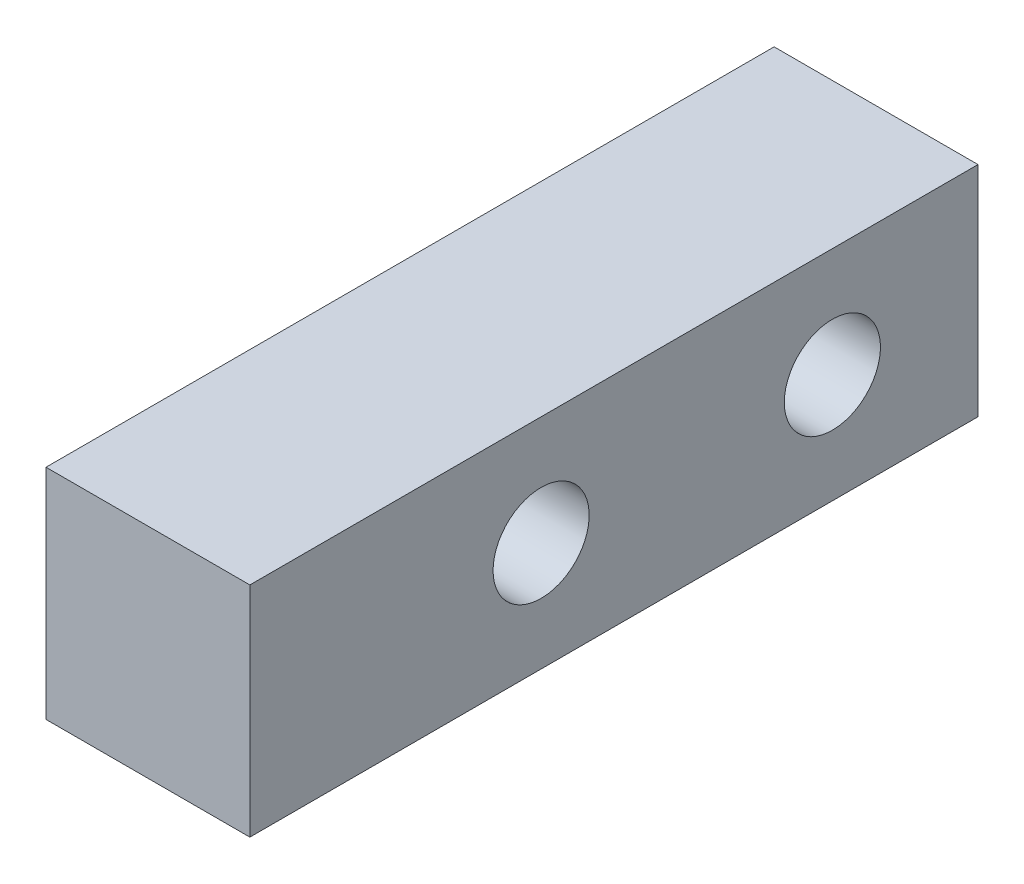
ISO-10303-21;
HEADER;
FILE_DESCRIPTION(('STEP AP214'),'2;1');
FILE_NAME('part.step','',(''),(''),'','','');
FILE_SCHEMA(('AUTOMOTIVE_DESIGN { 1 0 10303 214 1 1 1 1 }'));
ENDSEC;
DATA;
#1=APPLICATION_CONTEXT('core data for automotive mechanical design processes');
#2=APPLICATION_PROTOCOL_DEFINITION('international standard','automotive_design',2000,#1);
#3=PRODUCT_CONTEXT('',#1,'mechanical');
#4=PRODUCT('Part','Part','',(#3));
#5=PRODUCT_RELATED_PRODUCT_CATEGORY('part','',(#4));
#6=PRODUCT_DEFINITION_FORMATION('','',#4);
#7=PRODUCT_DEFINITION_CONTEXT('part definition',#1,'design');
#8=PRODUCT_DEFINITION('design','',#6,#7);
#9=PRODUCT_DEFINITION_SHAPE('','',#8);
#10=(LENGTH_UNIT() NAMED_UNIT(*) SI_UNIT(.MILLI.,.METRE.));
#11=(NAMED_UNIT(*) PLANE_ANGLE_UNIT() SI_UNIT($,.RADIAN.));
#12=(NAMED_UNIT(*) SI_UNIT($,.STERADIAN.) SOLID_ANGLE_UNIT());
#13=UNCERTAINTY_MEASURE_WITH_UNIT(LENGTH_MEASURE(1.E-05),#10,'distance_accuracy_value','');
#14=(GEOMETRIC_REPRESENTATION_CONTEXT(3) GLOBAL_UNCERTAINTY_ASSIGNED_CONTEXT((#13)) GLOBAL_UNIT_ASSIGNED_CONTEXT((#10,
#11,#12)) REPRESENTATION_CONTEXT('',''));
#15=CARTESIAN_POINT('',(0.,0.,0.));
#16=DIRECTION('',(0.,0.,1.));
#17=DIRECTION('',(1.,0.,0.));
#18=AXIS2_PLACEMENT_3D('',#15,#16,#17);
#19=CARTESIAN_POINT('',(-7.,7.5,50.));
#20=DIRECTION('',(1.,0.,0.));
#21=DIRECTION('',(0.,1.,0.));
#22=AXIS2_PLACEMENT_3D('',#19,#20,#21);
#23=PLANE('',#22);
#24=CARTESIAN_POINT('',(-7.,0.,10.));
#25=DIRECTION('',(-1.,0.,0.));
#26=DIRECTION('',(0.,0.,1.));
#27=AXIS2_PLACEMENT_3D('',#24,#25,#26);
#28=CIRCLE('',#27,7.2985);
#29=CARTESIAN_POINT('',(-7.,0.,17.2985));
#30=VERTEX_POINT('',#29);
#31=EDGE_CURVE('E139',#30,#30,#28,.T.);
#32=ORIENTED_EDGE('',*,*,#31,.F.);
#33=EDGE_LOOP('',(#32));
#34=FACE_BOUND('',#33,.T.);
#35=CARTESIAN_POINT('',(-7.,0.,30.));
#36=DIRECTION('',(-1.,0.,0.));
#37=DIRECTION('',(0.,0.,1.));
#38=AXIS2_PLACEMENT_3D('',#35,#36,#37);
#39=CIRCLE('',#38,7.2985);
#40=CARTESIAN_POINT('',(-7.,0.,37.2985));
#41=VERTEX_POINT('',#40);
#42=EDGE_CURVE('E124',#41,#41,#39,.T.);
#43=ORIENTED_EDGE('',*,*,#42,.F.);
#44=EDGE_LOOP('',(#43));
#45=FACE_BOUND('',#44,.T.);
#46=DIRECTION('',(0.,-1.,0.));
#47=VECTOR('',#46,1.);
#48=CARTESIAN_POINT('',(-7.,7.5,0.));
#49=LINE('',#48,#47);
#50=CARTESIAN_POINT('',(-7.,7.5,0.));
#51=VERTEX_POINT('',#50);
#52=CARTESIAN_POINT('',(-7.,-7.5,0.));
#53=VERTEX_POINT('',#52);
#54=EDGE_CURVE('E99',#51,#53,#49,.T.);
#55=ORIENTED_EDGE('',*,*,#54,.T.);
#56=DIRECTION('',(0.,0.,-1.));
#57=VECTOR('',#56,1.);
#58=CARTESIAN_POINT('',(-7.,-7.5,50.));
#59=LINE('',#58,#57);
#60=CARTESIAN_POINT('',(-7.,-7.5,50.));
#61=VERTEX_POINT('',#60);
#62=EDGE_CURVE('E11',#61,#53,#59,.T.);
#63=ORIENTED_EDGE('',*,*,#62,.F.);
#64=DIRECTION('',(0.,-1.,0.));
#65=VECTOR('',#64,1.);
#66=CARTESIAN_POINT('',(-7.,7.5,50.));
#67=LINE('',#66,#65);
#68=CARTESIAN_POINT('',(-7.,7.5,50.));
#69=VERTEX_POINT('',#68);
#70=EDGE_CURVE('E87',#69,#61,#67,.T.);
#71=ORIENTED_EDGE('',*,*,#70,.F.);
#72=DIRECTION('',(0.,0.,-1.));
#73=VECTOR('',#72,1.);
#74=CARTESIAN_POINT('',(-7.,7.5,50.));
#75=LINE('',#74,#73);
#76=EDGE_CURVE('E95',#69,#51,#75,.T.);
#77=ORIENTED_EDGE('',*,*,#76,.T.);
#78=EDGE_LOOP('',(#55,#63,#71,#77));
#79=FACE_BOUND('',#78,.T.);
#80=ADVANCED_FACE('F36',(#34,#45,#79),#23,.F.);
#81=CARTESIAN_POINT('',(7.,-7.5,50.));
#82=DIRECTION('',(0.,1.,0.));
#83=DIRECTION('',(-1.,0.,0.));
#84=AXIS2_PLACEMENT_3D('',#81,#82,#83);
#85=PLANE('',#84);
#86=DIRECTION('',(1.,0.,0.));
#87=VECTOR('',#86,1.);
#88=CARTESIAN_POINT('',(7.,-7.5,0.));
#89=LINE('',#88,#87);
#90=CARTESIAN_POINT('',(7.,-7.5,0.));
#91=VERTEX_POINT('',#90);
#92=EDGE_CURVE('E91',#53,#91,#89,.T.);
#93=ORIENTED_EDGE('',*,*,#92,.T.);
#94=DIRECTION('',(0.,0.,-1.));
#95=VECTOR('',#94,1.);
#96=CARTESIAN_POINT('',(7.,-7.5,50.));
#97=LINE('',#96,#95);
#98=CARTESIAN_POINT('',(7.,-7.5,50.));
#99=VERTEX_POINT('',#98);
#100=EDGE_CURVE('E44',#99,#91,#97,.T.);
#101=ORIENTED_EDGE('',*,*,#100,.F.);
#102=DIRECTION('',(1.,0.,0.));
#103=VECTOR('',#102,1.);
#104=CARTESIAN_POINT('',(7.,-7.5,50.));
#105=LINE('',#104,#103);
#106=EDGE_CURVE('E82',#61,#99,#105,.T.);
#107=ORIENTED_EDGE('',*,*,#106,.F.);
#108=ORIENTED_EDGE('',*,*,#62,.T.);
#109=EDGE_LOOP('',(#93,#101,#107,#108));
#110=FACE_BOUND('',#109,.T.);
#111=ADVANCED_FACE('F90',(#110),#85,.F.);
#112=CARTESIAN_POINT('',(7.,7.5,50.));
#113=DIRECTION('',(-1.,0.,0.));
#114=DIRECTION('',(0.,-1.,0.));
#115=AXIS2_PLACEMENT_3D('',#112,#113,#114);
#116=PLANE('',#115);
#117=CARTESIAN_POINT('',(7.,0.,10.));
#118=DIRECTION('',(-1.,0.,0.));
#119=DIRECTION('',(0.,0.,1.));
#120=AXIS2_PLACEMENT_3D('',#117,#118,#119);
#121=CIRCLE('',#120,3.3);
#122=CARTESIAN_POINT('',(7.,0.,13.3));
#123=VERTEX_POINT('',#122);
#124=EDGE_CURVE('E127',#123,#123,#121,.T.);
#125=ORIENTED_EDGE('',*,*,#124,.T.);
#126=EDGE_LOOP('',(#125));
#127=FACE_BOUND('',#126,.T.);
#128=CARTESIAN_POINT('',(7.,0.,30.));
#129=DIRECTION('',(-1.,0.,0.));
#130=DIRECTION('',(0.,0.,1.));
#131=AXIS2_PLACEMENT_3D('',#128,#129,#130);
#132=CIRCLE('',#131,3.3);
#133=CARTESIAN_POINT('',(7.,0.,33.3));
#134=VERTEX_POINT('',#133);
#135=EDGE_CURVE('E102',#134,#134,#132,.T.);
#136=ORIENTED_EDGE('',*,*,#135,.T.);
#137=EDGE_LOOP('',(#136));
#138=FACE_BOUND('',#137,.T.);
#139=DIRECTION('',(0.,1.,0.));
#140=VECTOR('',#139,1.);
#141=CARTESIAN_POINT('',(7.,7.5,0.));
#142=LINE('',#141,#140);
#143=CARTESIAN_POINT('',(7.,7.5,0.));
#144=VERTEX_POINT('',#143);
#145=EDGE_CURVE('E69',#91,#144,#142,.T.);
#146=ORIENTED_EDGE('',*,*,#145,.T.);
#147=DIRECTION('',(0.,0.,-1.));
#148=VECTOR('',#147,1.);
#149=CARTESIAN_POINT('',(7.,7.5,50.));
#150=LINE('',#149,#148);
#151=CARTESIAN_POINT('',(7.,7.5,50.));
#152=VERTEX_POINT('',#151);
#153=EDGE_CURVE('E92',#152,#144,#150,.T.);
#154=ORIENTED_EDGE('',*,*,#153,.F.);
#155=DIRECTION('',(0.,1.,0.));
#156=VECTOR('',#155,1.);
#157=CARTESIAN_POINT('',(7.,7.5,50.));
#158=LINE('',#157,#156);
#159=EDGE_CURVE('E85',#99,#152,#158,.T.);
#160=ORIENTED_EDGE('',*,*,#159,.F.);
#161=ORIENTED_EDGE('',*,*,#100,.T.);
#162=EDGE_LOOP('',(#146,#154,#160,#161));
#163=FACE_BOUND('',#162,.T.);
#164=ADVANCED_FACE('F93',(#127,#138,#163),#116,.F.);
#165=CARTESIAN_POINT('',(7.,7.5,50.));
#166=DIRECTION('',(0.,-1.,0.));
#167=DIRECTION('',(1.,0.,0.));
#168=AXIS2_PLACEMENT_3D('',#165,#166,#167);
#169=PLANE('',#168);
#170=DIRECTION('',(-1.,0.,0.));
#171=VECTOR('',#170,1.);
#172=CARTESIAN_POINT('',(7.,7.5,0.));
#173=LINE('',#172,#171);
#174=EDGE_CURVE('E75',#144,#51,#173,.T.);
#175=ORIENTED_EDGE('',*,*,#174,.T.);
#176=ORIENTED_EDGE('',*,*,#76,.F.);
#177=DIRECTION('',(-1.,0.,0.));
#178=VECTOR('',#177,1.);
#179=CARTESIAN_POINT('',(7.,7.5,50.));
#180=LINE('',#179,#178);
#181=EDGE_CURVE('E52',#152,#69,#180,.T.);
#182=ORIENTED_EDGE('',*,*,#181,.F.);
#183=ORIENTED_EDGE('',*,*,#153,.T.);
#184=EDGE_LOOP('',(#175,#176,#182,#183));
#185=FACE_BOUND('',#184,.T.);
#186=ADVANCED_FACE('F107',(#185),#169,.F.);
#187=CARTESIAN_POINT('',(0.,0.,50.));
#188=DIRECTION('',(0.,0.,-1.));
#189=DIRECTION('',(-1.,0.,0.));
#190=AXIS2_PLACEMENT_3D('',#187,#188,#189);
#191=PLANE('',#190);
#192=ORIENTED_EDGE('',*,*,#70,.T.);
#193=ORIENTED_EDGE('',*,*,#106,.T.);
#194=ORIENTED_EDGE('',*,*,#159,.T.);
#195=ORIENTED_EDGE('',*,*,#181,.T.);
#196=EDGE_LOOP('',(#192,#193,#194,#195));
#197=FACE_BOUND('',#196,.T.);
#198=ADVANCED_FACE('F83',(#197),#191,.F.);
#199=CARTESIAN_POINT('',(0.,0.,0.));
#200=DIRECTION('',(0.,0.,-1.));
#201=DIRECTION('',(-1.,0.,0.));
#202=AXIS2_PLACEMENT_3D('',#199,#200,#201);
#203=PLANE('',#202);
#204=ORIENTED_EDGE('',*,*,#54,.F.);
#205=ORIENTED_EDGE('',*,*,#174,.F.);
#206=ORIENTED_EDGE('',*,*,#145,.F.);
#207=ORIENTED_EDGE('',*,*,#92,.F.);
#208=EDGE_LOOP('',(#204,#205,#206,#207));
#209=FACE_BOUND('',#208,.T.);
#210=ADVANCED_FACE('F110',(#209),#203,.T.);
#211=CARTESIAN_POINT('',(-7.,0.,30.));
#212=DIRECTION('',(-1.,0.,0.));
#213=DIRECTION('',(0.,0.,1.));
#214=AXIS2_PLACEMENT_3D('',#211,#212,#213);
#215=CYLINDRICAL_SURFACE('',#214,3.3);
#216=ORIENTED_EDGE('',*,*,#135,.F.);
#217=EDGE_LOOP('',(#216));
#218=FACE_BOUND('',#217,.T.);
#219=CARTESIAN_POINT('',(-3.,0.,30.));
#220=DIRECTION('',(-1.,0.,0.));
#221=DIRECTION('',(0.,0.,1.));
#222=AXIS2_PLACEMENT_3D('',#219,#220,#221);
#223=CIRCLE('',#222,3.3);
#224=CARTESIAN_POINT('',(-3.,0.,33.3));
#225=VERTEX_POINT('',#224);
#226=EDGE_CURVE('E115',#225,#225,#223,.T.);
#227=ORIENTED_EDGE('',*,*,#226,.T.);
#228=EDGE_LOOP('',(#227));
#229=FACE_BOUND('',#228,.T.);
#230=ADVANCED_FACE('F170',(#218,#229),#215,.F.);
#231=CARTESIAN_POINT('',(-3.,7.2735,30.));
#232=DIRECTION('',(1.,0.,0.));
#233=DIRECTION('',(0.,0.,-1.));
#234=AXIS2_PLACEMENT_3D('',#231,#232,#233);
#235=PLANE('',#234);
#236=ORIENTED_EDGE('',*,*,#226,.F.);
#237=EDGE_LOOP('',(#236));
#238=FACE_BOUND('',#237,.T.);
#239=CARTESIAN_POINT('',(-3.,0.,30.));
#240=DIRECTION('',(-1.,0.,0.));
#241=DIRECTION('',(0.,0.,1.));
#242=AXIS2_PLACEMENT_3D('',#239,#240,#241);
#243=CIRCLE('',#242,7.2735);
#244=CARTESIAN_POINT('',(-3.,0.,37.2735));
#245=VERTEX_POINT('',#244);
#246=EDGE_CURVE('E118',#245,#245,#243,.T.);
#247=ORIENTED_EDGE('',*,*,#246,.T.);
#248=EDGE_LOOP('',(#247));
#249=FACE_BOUND('',#248,.T.);
#250=ADVANCED_FACE('F162',(#238,#249),#235,.F.);
#251=CARTESIAN_POINT('',(-7.,0.,30.));
#252=DIRECTION('',(-1.,0.,0.));
#253=DIRECTION('',(0.,0.,1.));
#254=AXIS2_PLACEMENT_3D('',#251,#252,#253);
#255=CYLINDRICAL_SURFACE('',#254,7.2735);
#256=ORIENTED_EDGE('',*,*,#246,.F.);
#257=EDGE_LOOP('',(#256));
#258=FACE_BOUND('',#257,.T.);
#259=CARTESIAN_POINT('',(-6.975,0.,30.));
#260=DIRECTION('',(-1.,0.,0.));
#261=DIRECTION('',(0.,0.,1.));
#262=AXIS2_PLACEMENT_3D('',#259,#260,#261);
#263=CIRCLE('',#262,7.2735);
#264=CARTESIAN_POINT('',(-6.975,0.,37.2735));
#265=VERTEX_POINT('',#264);
#266=EDGE_CURVE('E121',#265,#265,#263,.T.);
#267=ORIENTED_EDGE('',*,*,#266,.T.);
#268=EDGE_LOOP('',(#267));
#269=FACE_BOUND('',#268,.T.);
#270=ADVANCED_FACE('F152',(#258,#269),#255,.F.);
#271=CARTESIAN_POINT('',(-7.,0.,30.));
#272=DIRECTION('',(-1.,0.,0.));
#273=DIRECTION('',(0.,0.,1.));
#274=AXIS2_PLACEMENT_3D('',#271,#272,#273);
#275=CONICAL_SURFACE('',#274,7.2985,0.785398163397379);
#276=ORIENTED_EDGE('',*,*,#266,.F.);
#277=EDGE_LOOP('',(#276));
#278=FACE_BOUND('',#277,.T.);
#279=ORIENTED_EDGE('',*,*,#42,.T.);
#280=EDGE_LOOP('',(#279));
#281=FACE_BOUND('',#280,.T.);
#282=ADVANCED_FACE('F149',(#278,#281),#275,.F.);
#283=CARTESIAN_POINT('',(-7.,0.,10.));
#284=DIRECTION('',(-1.,0.,0.));
#285=DIRECTION('',(0.,0.,1.));
#286=AXIS2_PLACEMENT_3D('',#283,#284,#285);
#287=CYLINDRICAL_SURFACE('',#286,3.3);
#288=ORIENTED_EDGE('',*,*,#124,.F.);
#289=EDGE_LOOP('',(#288));
#290=FACE_BOUND('',#289,.T.);
#291=CARTESIAN_POINT('',(-3.,0.,10.));
#292=DIRECTION('',(-1.,0.,0.));
#293=DIRECTION('',(0.,0.,1.));
#294=AXIS2_PLACEMENT_3D('',#291,#292,#293);
#295=CIRCLE('',#294,3.3);
#296=CARTESIAN_POINT('',(-3.,0.,13.3));
#297=VERTEX_POINT('',#296);
#298=EDGE_CURVE('E130',#297,#297,#295,.T.);
#299=ORIENTED_EDGE('',*,*,#298,.T.);
#300=EDGE_LOOP('',(#299));
#301=FACE_BOUND('',#300,.T.);
#302=ADVANCED_FACE('F151',(#290,#301),#287,.F.);
#303=CARTESIAN_POINT('',(-3.,7.2735,10.));
#304=DIRECTION('',(1.,0.,0.));
#305=DIRECTION('',(0.,0.,-1.));
#306=AXIS2_PLACEMENT_3D('',#303,#304,#305);
#307=PLANE('',#306);
#308=ORIENTED_EDGE('',*,*,#298,.F.);
#309=EDGE_LOOP('',(#308));
#310=FACE_BOUND('',#309,.T.);
#311=CARTESIAN_POINT('',(-3.,0.,10.));
#312=DIRECTION('',(-1.,0.,0.));
#313=DIRECTION('',(0.,0.,1.));
#314=AXIS2_PLACEMENT_3D('',#311,#312,#313);
#315=CIRCLE('',#314,7.2735);
#316=CARTESIAN_POINT('',(-3.,0.,17.2735));
#317=VERTEX_POINT('',#316);
#318=EDGE_CURVE('E133',#317,#317,#315,.T.);
#319=ORIENTED_EDGE('',*,*,#318,.T.);
#320=EDGE_LOOP('',(#319));
#321=FACE_BOUND('',#320,.T.);
#322=ADVANCED_FACE('F159',(#310,#321),#307,.F.);
#323=CARTESIAN_POINT('',(-7.,0.,10.));
#324=DIRECTION('',(-1.,0.,0.));
#325=DIRECTION('',(0.,0.,1.));
#326=AXIS2_PLACEMENT_3D('',#323,#324,#325);
#327=CYLINDRICAL_SURFACE('',#326,7.2735);
#328=ORIENTED_EDGE('',*,*,#318,.F.);
#329=EDGE_LOOP('',(#328));
#330=FACE_BOUND('',#329,.T.);
#331=CARTESIAN_POINT('',(-6.975,0.,10.));
#332=DIRECTION('',(-1.,0.,0.));
#333=DIRECTION('',(0.,0.,1.));
#334=AXIS2_PLACEMENT_3D('',#331,#332,#333);
#335=CIRCLE('',#334,7.2735);
#336=CARTESIAN_POINT('',(-6.975,0.,17.2735));
#337=VERTEX_POINT('',#336);
#338=EDGE_CURVE('E136',#337,#337,#335,.T.);
#339=ORIENTED_EDGE('',*,*,#338,.T.);
#340=EDGE_LOOP('',(#339));
#341=FACE_BOUND('',#340,.T.);
#342=ADVANCED_FACE('F235',(#330,#341),#327,.F.);
#343=CARTESIAN_POINT('',(-7.,0.,10.));
#344=DIRECTION('',(-1.,0.,0.));
#345=DIRECTION('',(0.,0.,1.));
#346=AXIS2_PLACEMENT_3D('',#343,#344,#345);
#347=CONICAL_SURFACE('',#346,7.2985,0.785398163397379);
#348=ORIENTED_EDGE('',*,*,#338,.F.);
#349=EDGE_LOOP('',(#348));
#350=FACE_BOUND('',#349,.T.);
#351=ORIENTED_EDGE('',*,*,#31,.T.);
#352=EDGE_LOOP('',(#351));
#353=FACE_BOUND('',#352,.T.);
#354=ADVANCED_FACE('F143',(#350,#353),#347,.F.);
#355=CLOSED_SHELL('',(#80,#111,#164,#186,#198,#210,#230,#250,#270,#282,#302,#322,#342,#354));
#356=MANIFOLD_SOLID_BREP('B2',#355);
#357=ADVANCED_BREP_SHAPE_REPRESENTATION('',(#18,#356),#14);
#358=SHAPE_DEFINITION_REPRESENTATION(#9,#357);
ENDSEC;
END-ISO-10303-21;
